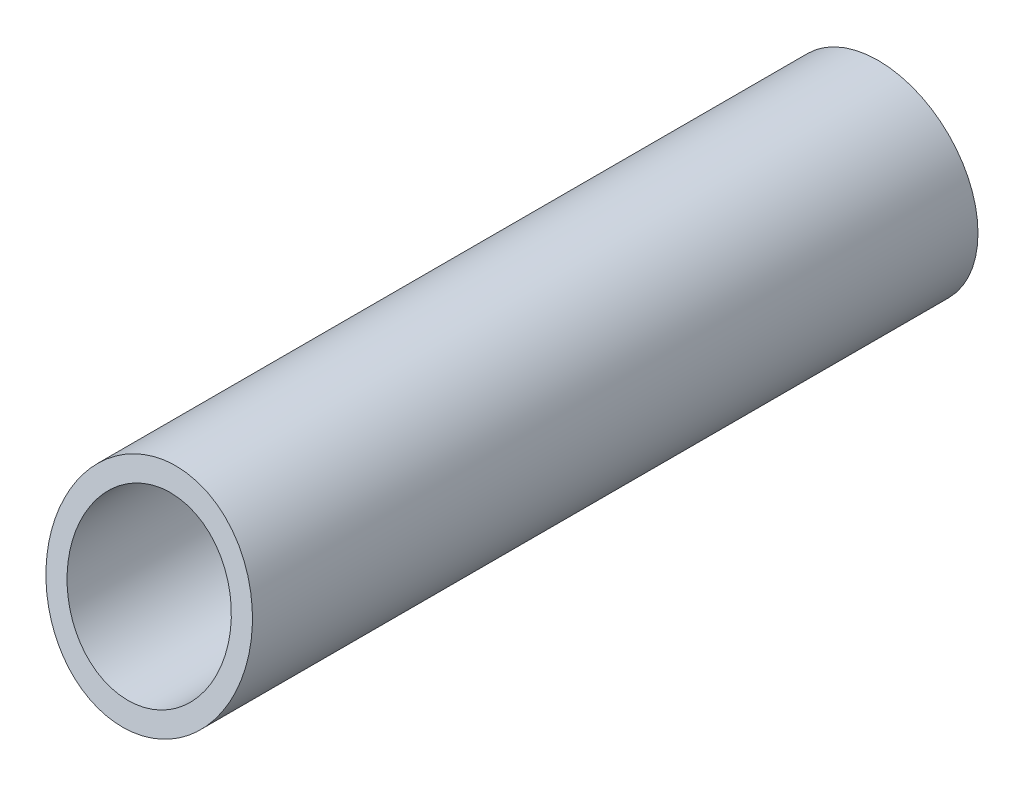
ISO-10303-21;
HEADER;
FILE_DESCRIPTION(('STEP AP214'),'2;1');
FILE_NAME('part.step','',(''),(''),'','','');
FILE_SCHEMA(('AUTOMOTIVE_DESIGN { 1 0 10303 214 1 1 1 1 }'));
ENDSEC;
DATA;
#1=APPLICATION_CONTEXT('core data for automotive mechanical design processes');
#2=APPLICATION_PROTOCOL_DEFINITION('international standard','automotive_design',2000,#1);
#3=PRODUCT_CONTEXT('',#1,'mechanical');
#4=PRODUCT('Part','Part','',(#3));
#5=PRODUCT_RELATED_PRODUCT_CATEGORY('part','',(#4));
#6=PRODUCT_DEFINITION_FORMATION('','',#4);
#7=PRODUCT_DEFINITION_CONTEXT('part definition',#1,'design');
#8=PRODUCT_DEFINITION('design','',#6,#7);
#9=PRODUCT_DEFINITION_SHAPE('','',#8);
#10=(LENGTH_UNIT() NAMED_UNIT(*) SI_UNIT(.MILLI.,.METRE.));
#11=(NAMED_UNIT(*) PLANE_ANGLE_UNIT() SI_UNIT($,.RADIAN.));
#12=(NAMED_UNIT(*) SI_UNIT($,.STERADIAN.) SOLID_ANGLE_UNIT());
#13=UNCERTAINTY_MEASURE_WITH_UNIT(LENGTH_MEASURE(1.E-05),#10,'distance_accuracy_value','');
#14=(GEOMETRIC_REPRESENTATION_CONTEXT(3) GLOBAL_UNCERTAINTY_ASSIGNED_CONTEXT((#13)) GLOBAL_UNIT_ASSIGNED_CONTEXT((#10,
#11,#12)) REPRESENTATION_CONTEXT('',''));
#15=CARTESIAN_POINT('',(0.,0.,0.));
#16=DIRECTION('',(0.,0.,1.));
#17=DIRECTION('',(1.,0.,0.));
#18=AXIS2_PLACEMENT_3D('',#15,#16,#17);
#19=CARTESIAN_POINT('',(0.,0.,63.5));
#20=DIRECTION('',(0.,0.,-1.));
#21=DIRECTION('',(0.,-1.,0.));
#22=AXIS2_PLACEMENT_3D('',#19,#20,#21);
#23=CYLINDRICAL_SURFACE('',#22,13.335);
#24=CARTESIAN_POINT('',(0.,0.,59.0080997380848));
#25=DIRECTION('',(0.,-0.258819045102512,-0.965925826289071));
#26=DIRECTION('',(0.,0.965925826289071,-0.258819045102512));
#27=AXIS2_PLACEMENT_3D('',#24,#25,#26);
#28=ELLIPSE('',#27,13.8054078657685,13.335);
#29=CARTESIAN_POINT('',(0.,13.3350000000001,55.4349972570159));
#30=VERTEX_POINT('',#29);
#31=EDGE_CURVE('E29',#30,#30,#28,.T.);
#32=ORIENTED_EDGE('',*,*,#31,.F.);
#33=EDGE_LOOP('',(#32));
#34=FACE_BOUND('',#33,.T.);
#35=CARTESIAN_POINT('',(0.,0.,-63.5));
#36=DIRECTION('',(0.,0.,1.));
#37=DIRECTION('',(1.,0.,0.));
#38=AXIS2_PLACEMENT_3D('',#35,#36,#37);
#39=CIRCLE('',#38,13.335);
#40=CARTESIAN_POINT('',(13.335,0.,-63.5));
#41=VERTEX_POINT('',#40);
#42=EDGE_CURVE('E25',#41,#41,#39,.T.);
#43=ORIENTED_EDGE('',*,*,#42,.F.);
#44=EDGE_LOOP('',(#43));
#45=FACE_BOUND('',#44,.T.);
#46=ADVANCED_FACE('F14',(#34,#45),#23,.F.);
#47=CARTESIAN_POINT('',(0.,0.,63.5));
#48=DIRECTION('',(0.,0.,-1.));
#49=DIRECTION('',(0.,-1.,0.));
#50=AXIS2_PLACEMENT_3D('',#47,#48,#49);
#51=CYLINDRICAL_SURFACE('',#50,16.764);
#52=CARTESIAN_POINT('',(0.,0.,59.0080997380848));
#53=DIRECTION('',(0.,-0.258819045102511,-0.965925826289071));
#54=DIRECTION('',(0.,0.965925826289071,-0.258819045102511));
#55=AXIS2_PLACEMENT_3D('',#52,#53,#54);
#56=ELLIPSE('',#55,17.3553698883946,16.764);
#57=CARTESIAN_POINT('',(0.,16.764,54.5161994761697));
#58=VERTEX_POINT('',#57);
#59=EDGE_CURVE('E9',#58,#58,#56,.T.);
#60=ORIENTED_EDGE('',*,*,#59,.T.);
#61=EDGE_LOOP('',(#60));
#62=FACE_BOUND('',#61,.T.);
#63=CARTESIAN_POINT('',(0.,0.,-63.5));
#64=DIRECTION('',(0.,0.,1.));
#65=DIRECTION('',(1.,0.,0.));
#66=AXIS2_PLACEMENT_3D('',#63,#64,#65);
#67=CIRCLE('',#66,16.764);
#68=CARTESIAN_POINT('',(16.764,0.,-63.5));
#69=VERTEX_POINT('',#68);
#70=EDGE_CURVE('E18',#69,#69,#67,.T.);
#71=ORIENTED_EDGE('',*,*,#70,.T.);
#72=EDGE_LOOP('',(#71));
#73=FACE_BOUND('',#72,.T.);
#74=ADVANCED_FACE('F16',(#62,#73),#51,.T.);
#75=CARTESIAN_POINT('',(0.,0.,-63.5));
#76=DIRECTION('',(0.,0.,1.));
#77=DIRECTION('',(1.,0.,0.));
#78=AXIS2_PLACEMENT_3D('',#75,#76,#77);
#79=PLANE('',#78);
#80=ORIENTED_EDGE('',*,*,#70,.F.);
#81=EDGE_LOOP('',(#80));
#82=FACE_BOUND('',#81,.T.);
#83=ORIENTED_EDGE('',*,*,#42,.T.);
#84=EDGE_LOOP('',(#83));
#85=FACE_BOUND('',#84,.T.);
#86=ADVANCED_FACE('F39',(#82,#85),#79,.F.);
#87=CARTESIAN_POINT('',(-16.764,-16.764,63.5));
#88=DIRECTION('',(0.,-0.258819045102511,-0.965925826289071));
#89=DIRECTION('',(0.,0.965925826289071,-0.258819045102511));
#90=AXIS2_PLACEMENT_3D('',#87,#88,#89);
#91=PLANE('',#90);
#92=ORIENTED_EDGE('',*,*,#59,.F.);
#93=EDGE_LOOP('',(#92));
#94=FACE_BOUND('',#93,.T.);
#95=ORIENTED_EDGE('',*,*,#31,.T.);
#96=EDGE_LOOP('',(#95));
#97=FACE_BOUND('',#96,.T.);
#98=ADVANCED_FACE('F33',(#94,#97),#91,.F.);
#99=CLOSED_SHELL('',(#46,#74,#86,#98));
#100=MANIFOLD_SOLID_BREP('B1',#99);
#101=ADVANCED_BREP_SHAPE_REPRESENTATION('',(#18,#100),#14);
#102=SHAPE_DEFINITION_REPRESENTATION(#9,#101);
ENDSEC;
END-ISO-10303-21;
